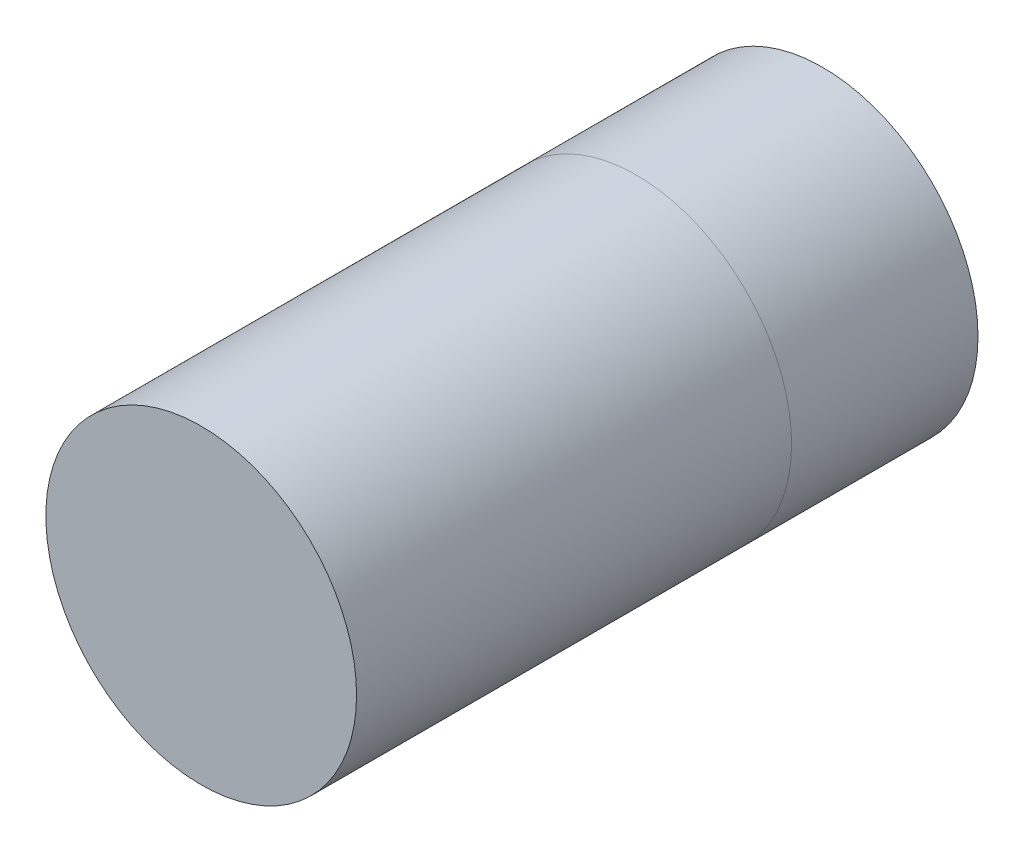
ISO-10303-21;
HEADER;
FILE_DESCRIPTION(('STEP AP214'),'2;1');
FILE_NAME('part.step','',(''),(''),'','','');
FILE_SCHEMA(('AUTOMOTIVE_DESIGN { 1 0 10303 214 1 1 1 1 }'));
ENDSEC;
DATA;
#1=APPLICATION_CONTEXT('core data for automotive mechanical design processes');
#2=APPLICATION_PROTOCOL_DEFINITION('international standard','automotive_design',2000,#1);
#3=PRODUCT_CONTEXT('',#1,'mechanical');
#4=PRODUCT('Part','Part','',(#3));
#5=PRODUCT_RELATED_PRODUCT_CATEGORY('part','',(#4));
#6=PRODUCT_DEFINITION_FORMATION('','',#4);
#7=PRODUCT_DEFINITION_CONTEXT('part definition',#1,'design');
#8=PRODUCT_DEFINITION('design','',#6,#7);
#9=PRODUCT_DEFINITION_SHAPE('','',#8);
#10=(LENGTH_UNIT() NAMED_UNIT(*) SI_UNIT(.MILLI.,.METRE.));
#11=(NAMED_UNIT(*) PLANE_ANGLE_UNIT() SI_UNIT($,.RADIAN.));
#12=(NAMED_UNIT(*) SI_UNIT($,.STERADIAN.) SOLID_ANGLE_UNIT());
#13=UNCERTAINTY_MEASURE_WITH_UNIT(LENGTH_MEASURE(1.E-05),#10,'distance_accuracy_value','');
#14=(GEOMETRIC_REPRESENTATION_CONTEXT(3) GLOBAL_UNCERTAINTY_ASSIGNED_CONTEXT((#13)) GLOBAL_UNIT_ASSIGNED_CONTEXT((#10,
#11,#12)) REPRESENTATION_CONTEXT('',''));
#15=CARTESIAN_POINT('',(0.,0.,0.));
#16=DIRECTION('',(0.,0.,1.));
#17=DIRECTION('',(1.,0.,0.));
#18=AXIS2_PLACEMENT_3D('',#15,#16,#17);
#19=CARTESIAN_POINT('',(0.,0.,10.));
#20=DIRECTION('',(0.,0.,-1.));
#21=DIRECTION('',(-1.,0.,0.));
#22=AXIS2_PLACEMENT_3D('',#19,#20,#21);
#23=CYLINDRICAL_SURFACE('',#22,2.5);
#24=CARTESIAN_POINT('',(0.,0.,10.));
#25=DIRECTION('',(0.,0.,1.));
#26=DIRECTION('',(1.,0.,0.));
#27=AXIS2_PLACEMENT_3D('',#24,#25,#26);
#28=CIRCLE('',#27,2.5);
#29=CARTESIAN_POINT('',(2.5,0.,10.));
#30=VERTEX_POINT('',#29);
#31=EDGE_CURVE('E11',#30,#30,#28,.T.);
#32=ORIENTED_EDGE('',*,*,#31,.F.);
#33=EDGE_LOOP('',(#32));
#34=FACE_BOUND('',#33,.T.);
#35=CARTESIAN_POINT('',(0.,0.,3.));
#36=DIRECTION('',(0.,0.,1.));
#37=DIRECTION('',(1.,0.,0.));
#38=AXIS2_PLACEMENT_3D('',#35,#36,#37);
#39=CIRCLE('',#38,2.5);
#40=CARTESIAN_POINT('',(2.5,0.,3.));
#41=VERTEX_POINT('',#40);
#42=EDGE_CURVE('E54',#41,#41,#39,.T.);
#43=ORIENTED_EDGE('',*,*,#42,.T.);
#44=EDGE_LOOP('',(#43));
#45=FACE_BOUND('',#44,.T.);
#46=ADVANCED_FACE('F51',(#34,#45),#23,.T.);
#47=CARTESIAN_POINT('',(0.,0.,10.));
#48=DIRECTION('',(0.,0.,1.));
#49=DIRECTION('',(1.,0.,0.));
#50=AXIS2_PLACEMENT_3D('',#47,#48,#49);
#51=PLANE('',#50);
#52=ORIENTED_EDGE('',*,*,#31,.T.);
#53=EDGE_LOOP('',(#52));
#54=FACE_BOUND('',#53,.T.);
#55=ADVANCED_FACE('F66',(#54),#51,.T.);
#56=CARTESIAN_POINT('',(0.,0.,3.));
#57=DIRECTION('',(0.,0.,1.));
#58=DIRECTION('',(1.,0.,0.));
#59=AXIS2_PLACEMENT_3D('',#56,#57,#58);
#60=PLANE('',#59);
#61=ORIENTED_EDGE('',*,*,#42,.F.);
#62=EDGE_LOOP('',(#61));
#63=FACE_BOUND('',#62,.T.);
#64=ADVANCED_FACE('F64',(#63),#60,.F.);
#65=CLOSED_SHELL('',(#46,#55,#64));
#66=MANIFOLD_SOLID_BREP('B2',#65);
#67=CARTESIAN_POINT('',(0.,0.,3.));
#68=DIRECTION('',(0.,0.,-1.));
#69=DIRECTION('',(-1.,0.,0.));
#70=AXIS2_PLACEMENT_3D('',#67,#68,#69);
#71=CYLINDRICAL_SURFACE('',#70,2.5);
#72=CARTESIAN_POINT('',(0.,0.,3.));
#73=DIRECTION('',(0.,0.,1.));
#74=DIRECTION('',(1.,0.,0.));
#75=AXIS2_PLACEMENT_3D('',#72,#73,#74);
#76=CIRCLE('',#75,2.5);
#77=CARTESIAN_POINT('',(2.5,0.,3.));
#78=VERTEX_POINT('',#77);
#79=EDGE_CURVE('E50',#78,#78,#76,.T.);
#80=ORIENTED_EDGE('',*,*,#79,.F.);
#81=EDGE_LOOP('',(#80));
#82=FACE_BOUND('',#81,.T.);
#83=CARTESIAN_POINT('',(0.,0.,0.));
#84=DIRECTION('',(0.,0.,1.));
#85=DIRECTION('',(1.,0.,0.));
#86=AXIS2_PLACEMENT_3D('',#83,#84,#85);
#87=CIRCLE('',#86,2.5);
#88=CARTESIAN_POINT('',(2.5,0.,0.));
#89=VERTEX_POINT('',#88);
#90=EDGE_CURVE('E103',#89,#89,#87,.T.);
#91=ORIENTED_EDGE('',*,*,#90,.T.);
#92=EDGE_LOOP('',(#91));
#93=FACE_BOUND('',#92,.T.);
#94=ADVANCED_FACE('F100',(#82,#93),#71,.T.);
#95=CARTESIAN_POINT('',(0.,0.,3.));
#96=DIRECTION('',(0.,0.,1.));
#97=DIRECTION('',(1.,0.,0.));
#98=AXIS2_PLACEMENT_3D('',#95,#96,#97);
#99=PLANE('',#98);
#100=ORIENTED_EDGE('',*,*,#79,.T.);
#101=EDGE_LOOP('',(#100));
#102=FACE_BOUND('',#101,.T.);
#103=ADVANCED_FACE('F115',(#102),#99,.T.);
#104=CARTESIAN_POINT('',(0.,0.,0.));
#105=DIRECTION('',(0.,0.,1.));
#106=DIRECTION('',(1.,0.,0.));
#107=AXIS2_PLACEMENT_3D('',#104,#105,#106);
#108=PLANE('',#107);
#109=ORIENTED_EDGE('',*,*,#90,.F.);
#110=EDGE_LOOP('',(#109));
#111=FACE_BOUND('',#110,.T.);
#112=ADVANCED_FACE('F113',(#111),#108,.F.);
#113=CLOSED_SHELL('',(#94,#103,#112));
#114=MANIFOLD_SOLID_BREP('B6',#113);
#115=ADVANCED_BREP_SHAPE_REPRESENTATION('',(#18,#66,#114),#14);
#116=SHAPE_DEFINITION_REPRESENTATION(#9,#115);
ENDSEC;
END-ISO-10303-21;
